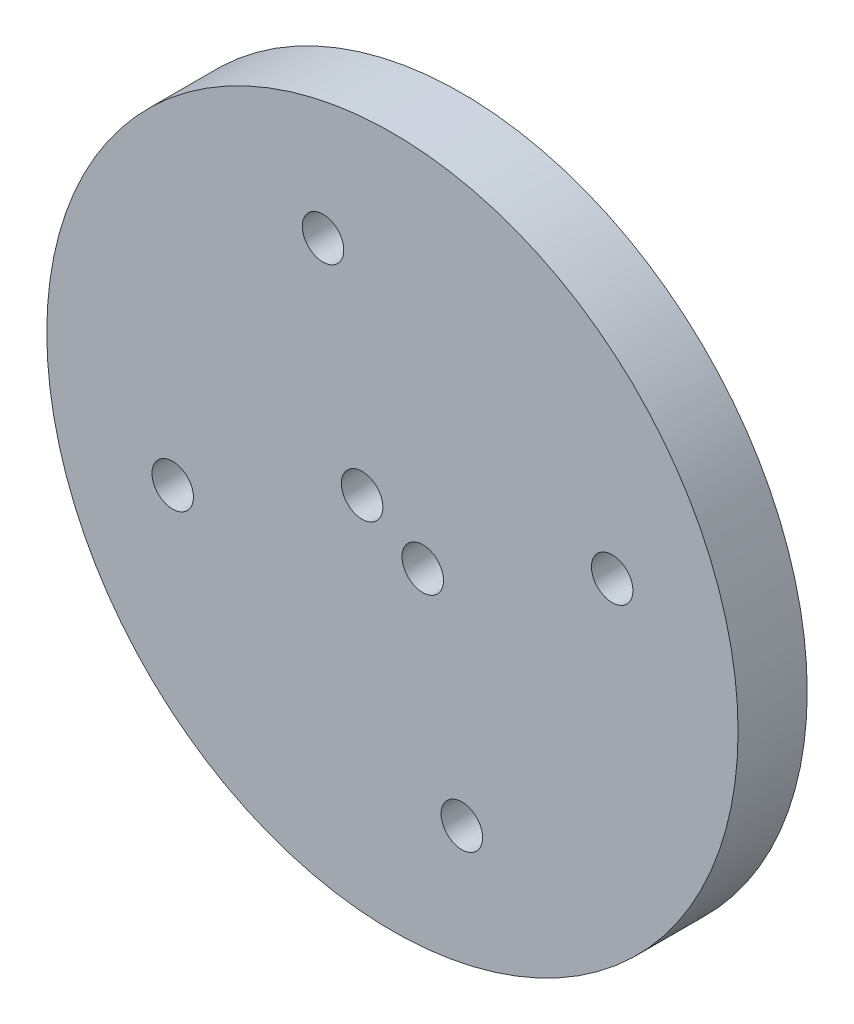
ISO-10303-21;
HEADER;
FILE_DESCRIPTION(('STEP AP214'),'2;1');
FILE_NAME('part.step','',(''),(''),'','','');
FILE_SCHEMA(('AUTOMOTIVE_DESIGN { 1 0 10303 214 1 1 1 1 }'));
ENDSEC;
DATA;
#1=APPLICATION_CONTEXT('core data for automotive mechanical design processes');
#2=APPLICATION_PROTOCOL_DEFINITION('international standard','automotive_design',2000,#1);
#3=PRODUCT_CONTEXT('',#1,'mechanical');
#4=PRODUCT('Part','Part','',(#3));
#5=PRODUCT_RELATED_PRODUCT_CATEGORY('part','',(#4));
#6=PRODUCT_DEFINITION_FORMATION('','',#4);
#7=PRODUCT_DEFINITION_CONTEXT('part definition',#1,'design');
#8=PRODUCT_DEFINITION('design','',#6,#7);
#9=PRODUCT_DEFINITION_SHAPE('','',#8);
#10=(LENGTH_UNIT() NAMED_UNIT(*) SI_UNIT(.MILLI.,.METRE.));
#11=(NAMED_UNIT(*) PLANE_ANGLE_UNIT() SI_UNIT($,.RADIAN.));
#12=(NAMED_UNIT(*) SI_UNIT($,.STERADIAN.) SOLID_ANGLE_UNIT());
#13=UNCERTAINTY_MEASURE_WITH_UNIT(LENGTH_MEASURE(1.E-05),#10,'distance_accuracy_value','');
#14=(GEOMETRIC_REPRESENTATION_CONTEXT(3) GLOBAL_UNCERTAINTY_ASSIGNED_CONTEXT((#13)) GLOBAL_UNIT_ASSIGNED_CONTEXT((#10,
#11,#12)) REPRESENTATION_CONTEXT('',''));
#15=CARTESIAN_POINT('',(0.,0.,0.));
#16=DIRECTION('',(0.,0.,1.));
#17=DIRECTION('',(1.,0.,0.));
#18=AXIS2_PLACEMENT_3D('',#15,#16,#17);
#19=CARTESIAN_POINT('',(0.,0.,3.));
#20=DIRECTION('',(0.,0.,-1.));
#21=DIRECTION('',(-1.,0.,0.));
#22=AXIS2_PLACEMENT_3D('',#19,#20,#21);
#23=CYLINDRICAL_SURFACE('',#22,15.);
#24=CARTESIAN_POINT('',(0.,0.,3.));
#25=DIRECTION('',(0.,0.,1.));
#26=DIRECTION('',(1.,0.,0.));
#27=AXIS2_PLACEMENT_3D('',#24,#25,#26);
#28=CIRCLE('',#27,15.);
#29=CARTESIAN_POINT('',(15.,0.,3.));
#30=VERTEX_POINT('',#29);
#31=EDGE_CURVE('E10',#30,#30,#28,.T.);
#32=ORIENTED_EDGE('',*,*,#31,.F.);
#33=EDGE_LOOP('',(#32));
#34=FACE_BOUND('',#33,.T.);
#35=CARTESIAN_POINT('',(0.,0.,0.));
#36=DIRECTION('',(0.,0.,1.));
#37=DIRECTION('',(1.,0.,0.));
#38=AXIS2_PLACEMENT_3D('',#35,#36,#37);
#39=CIRCLE('',#38,15.);
#40=CARTESIAN_POINT('',(15.,0.,0.));
#41=VERTEX_POINT('',#40);
#42=EDGE_CURVE('E36',#41,#41,#39,.T.);
#43=ORIENTED_EDGE('',*,*,#42,.T.);
#44=EDGE_LOOP('',(#43));
#45=FACE_BOUND('',#44,.T.);
#46=ADVANCED_FACE('F33',(#34,#45),#23,.T.);
#47=CARTESIAN_POINT('',(0.,0.,3.));
#48=DIRECTION('',(0.,0.,1.));
#49=DIRECTION('',(1.,0.,0.));
#50=AXIS2_PLACEMENT_3D('',#47,#48,#49);
#51=PLANE('',#50);
#52=CARTESIAN_POINT('',(3.0112228113094,-9.53585534604263,3.));
#53=DIRECTION('',(0.,0.,-1.));
#54=DIRECTION('',(-1.,0.,0.));
#55=AXIS2_PLACEMENT_3D('',#52,#53,#54);
#56=CIRCLE('',#55,0.9);
#57=CARTESIAN_POINT('',(2.1112228113094,-9.53585534604263,3.));
#58=VERTEX_POINT('',#57);
#59=EDGE_CURVE('E51',#58,#58,#56,.T.);
#60=ORIENTED_EDGE('',*,*,#59,.T.);
#61=EDGE_LOOP('',(#60));
#62=FACE_BOUND('',#61,.T.);
#63=CARTESIAN_POINT('',(1.3159978802333,-0.719826075674858,3.));
#64=DIRECTION('',(0.,0.,-1.));
#65=DIRECTION('',(-1.,0.,0.));
#66=AXIS2_PLACEMENT_3D('',#63,#64,#65);
#67=CIRCLE('',#66,0.9);
#68=CARTESIAN_POINT('',(0.415997880233298,-0.719826075674858,3.));
#69=VERTEX_POINT('',#68);
#70=EDGE_CURVE('E57',#69,#69,#67,.T.);
#71=ORIENTED_EDGE('',*,*,#70,.T.);
#72=EDGE_LOOP('',(#71));
#73=FACE_BOUND('',#72,.T.);
#74=CARTESIAN_POINT('',(-9.53585534604263,-3.0112228113094,3.));
#75=DIRECTION('',(0.,0.,-1.));
#76=DIRECTION('',(-1.,0.,0.));
#77=AXIS2_PLACEMENT_3D('',#74,#75,#76);
#78=CIRCLE('',#77,0.9);
#79=CARTESIAN_POINT('',(-10.4358553460426,-3.0112228113094,3.));
#80=VERTEX_POINT('',#79);
#81=EDGE_CURVE('E63',#80,#80,#78,.T.);
#82=ORIENTED_EDGE('',*,*,#81,.T.);
#83=EDGE_LOOP('',(#82));
#84=FACE_BOUND('',#83,.T.);
#85=CARTESIAN_POINT('',(9.53585534604263,3.0112228113094,3.));
#86=DIRECTION('',(0.,0.,-1.));
#87=DIRECTION('',(-1.,0.,0.));
#88=AXIS2_PLACEMENT_3D('',#85,#86,#87);
#89=CIRCLE('',#88,0.9);
#90=CARTESIAN_POINT('',(8.63585534604264,3.0112228113094,3.));
#91=VERTEX_POINT('',#90);
#92=EDGE_CURVE('E69',#91,#91,#89,.T.);
#93=ORIENTED_EDGE('',*,*,#92,.T.);
#94=EDGE_LOOP('',(#93));
#95=FACE_BOUND('',#94,.T.);
#96=CARTESIAN_POINT('',(-3.0112228113094,9.53585534604263,3.));
#97=DIRECTION('',(0.,0.,-1.));
#98=DIRECTION('',(-1.,0.,0.));
#99=AXIS2_PLACEMENT_3D('',#96,#97,#98);
#100=CIRCLE('',#99,0.9);
#101=CARTESIAN_POINT('',(-3.9112228113094,9.53585534604263,3.));
#102=VERTEX_POINT('',#101);
#103=EDGE_CURVE('E75',#102,#102,#100,.T.);
#104=ORIENTED_EDGE('',*,*,#103,.T.);
#105=EDGE_LOOP('',(#104));
#106=FACE_BOUND('',#105,.T.);
#107=CARTESIAN_POINT('',(-1.3159978802333,0.719826075674858,3.));
#108=DIRECTION('',(0.,0.,-1.));
#109=DIRECTION('',(-1.,0.,0.));
#110=AXIS2_PLACEMENT_3D('',#107,#108,#109);
#111=CIRCLE('',#110,0.9);
#112=CARTESIAN_POINT('',(-2.2159978802333,0.719826075674858,3.));
#113=VERTEX_POINT('',#112);
#114=EDGE_CURVE('E43',#113,#113,#111,.T.);
#115=ORIENTED_EDGE('',*,*,#114,.T.);
#116=EDGE_LOOP('',(#115));
#117=FACE_BOUND('',#116,.T.);
#118=ORIENTED_EDGE('',*,*,#31,.T.);
#119=EDGE_LOOP('',(#118));
#120=FACE_BOUND('',#119,.T.);
#121=ADVANCED_FACE('F87',(#62,#73,#84,#95,#106,#117,#120),#51,.T.);
#122=CARTESIAN_POINT('',(0.,0.,0.));
#123=DIRECTION('',(0.,0.,1.));
#124=DIRECTION('',(1.,0.,0.));
#125=AXIS2_PLACEMENT_3D('',#122,#123,#124);
#126=PLANE('',#125);
#127=CARTESIAN_POINT('',(3.0112228113094,-9.53585534604263,0.));
#128=DIRECTION('',(0.,0.,-1.));
#129=DIRECTION('',(-1.,0.,0.));
#130=AXIS2_PLACEMENT_3D('',#127,#128,#129);
#131=CIRCLE('',#130,0.9);
#132=CARTESIAN_POINT('',(2.1112228113094,-9.53585534604263,0.));
#133=VERTEX_POINT('',#132);
#134=EDGE_CURVE('E54',#133,#133,#131,.T.);
#135=ORIENTED_EDGE('',*,*,#134,.F.);
#136=EDGE_LOOP('',(#135));
#137=FACE_BOUND('',#136,.T.);
#138=CARTESIAN_POINT('',(1.3159978802333,-0.719826075674858,0.));
#139=DIRECTION('',(0.,0.,-1.));
#140=DIRECTION('',(-1.,0.,0.));
#141=AXIS2_PLACEMENT_3D('',#138,#139,#140);
#142=CIRCLE('',#141,0.9);
#143=CARTESIAN_POINT('',(0.415997880233298,-0.719826075674858,0.));
#144=VERTEX_POINT('',#143);
#145=EDGE_CURVE('E60',#144,#144,#142,.T.);
#146=ORIENTED_EDGE('',*,*,#145,.F.);
#147=EDGE_LOOP('',(#146));
#148=FACE_BOUND('',#147,.T.);
#149=CARTESIAN_POINT('',(-9.53585534604263,-3.0112228113094,0.));
#150=DIRECTION('',(0.,0.,-1.));
#151=DIRECTION('',(-1.,0.,0.));
#152=AXIS2_PLACEMENT_3D('',#149,#150,#151);
#153=CIRCLE('',#152,0.9);
#154=CARTESIAN_POINT('',(-10.4358553460426,-3.0112228113094,0.));
#155=VERTEX_POINT('',#154);
#156=EDGE_CURVE('E66',#155,#155,#153,.T.);
#157=ORIENTED_EDGE('',*,*,#156,.F.);
#158=EDGE_LOOP('',(#157));
#159=FACE_BOUND('',#158,.T.);
#160=CARTESIAN_POINT('',(9.53585534604263,3.0112228113094,0.));
#161=DIRECTION('',(0.,0.,-1.));
#162=DIRECTION('',(-1.,0.,0.));
#163=AXIS2_PLACEMENT_3D('',#160,#161,#162);
#164=CIRCLE('',#163,0.9);
#165=CARTESIAN_POINT('',(8.63585534604264,3.0112228113094,0.));
#166=VERTEX_POINT('',#165);
#167=EDGE_CURVE('E72',#166,#166,#164,.T.);
#168=ORIENTED_EDGE('',*,*,#167,.F.);
#169=EDGE_LOOP('',(#168));
#170=FACE_BOUND('',#169,.T.);
#171=CARTESIAN_POINT('',(-3.0112228113094,9.53585534604263,0.));
#172=DIRECTION('',(0.,0.,-1.));
#173=DIRECTION('',(-1.,0.,0.));
#174=AXIS2_PLACEMENT_3D('',#171,#172,#173);
#175=CIRCLE('',#174,0.9);
#176=CARTESIAN_POINT('',(-3.9112228113094,9.53585534604263,0.));
#177=VERTEX_POINT('',#176);
#178=EDGE_CURVE('E48',#177,#177,#175,.T.);
#179=ORIENTED_EDGE('',*,*,#178,.F.);
#180=EDGE_LOOP('',(#179));
#181=FACE_BOUND('',#180,.T.);
#182=CARTESIAN_POINT('',(-1.3159978802333,0.719826075674858,0.));
#183=DIRECTION('',(0.,0.,-1.));
#184=DIRECTION('',(-1.,0.,0.));
#185=AXIS2_PLACEMENT_3D('',#182,#183,#184);
#186=CIRCLE('',#185,0.9);
#187=CARTESIAN_POINT('',(-2.2159978802333,0.719826075674858,0.));
#188=VERTEX_POINT('',#187);
#189=EDGE_CURVE('E45',#188,#188,#186,.T.);
#190=ORIENTED_EDGE('',*,*,#189,.F.);
#191=EDGE_LOOP('',(#190));
#192=FACE_BOUND('',#191,.T.);
#193=ORIENTED_EDGE('',*,*,#42,.F.);
#194=EDGE_LOOP('',(#193));
#195=FACE_BOUND('',#194,.T.);
#196=ADVANCED_FACE('F83',(#137,#148,#159,#170,#181,#192,#195),#126,.F.);
#197=CARTESIAN_POINT('',(-1.3159978802333,0.719826075674858,3.));
#198=DIRECTION('',(0.,0.,-1.));
#199=DIRECTION('',(-1.,0.,0.));
#200=AXIS2_PLACEMENT_3D('',#197,#198,#199);
#201=CYLINDRICAL_SURFACE('',#200,0.9);
#202=ORIENTED_EDGE('',*,*,#114,.F.);
#203=EDGE_LOOP('',(#202));
#204=FACE_BOUND('',#203,.T.);
#205=ORIENTED_EDGE('',*,*,#189,.T.);
#206=EDGE_LOOP('',(#205));
#207=FACE_BOUND('',#206,.T.);
#208=ADVANCED_FACE('F86',(#204,#207),#201,.F.);
#209=CARTESIAN_POINT('',(-3.0112228113094,9.53585534604263,3.));
#210=DIRECTION('',(0.,0.,-1.));
#211=DIRECTION('',(-1.,0.,0.));
#212=AXIS2_PLACEMENT_3D('',#209,#210,#211);
#213=CYLINDRICAL_SURFACE('',#212,0.9);
#214=ORIENTED_EDGE('',*,*,#103,.F.);
#215=EDGE_LOOP('',(#214));
#216=FACE_BOUND('',#215,.T.);
#217=ORIENTED_EDGE('',*,*,#178,.T.);
#218=EDGE_LOOP('',(#217));
#219=FACE_BOUND('',#218,.T.);
#220=ADVANCED_FACE('F81',(#216,#219),#213,.F.);
#221=CARTESIAN_POINT('',(9.53585534604263,3.0112228113094,3.));
#222=DIRECTION('',(0.,0.,-1.));
#223=DIRECTION('',(-1.,0.,0.));
#224=AXIS2_PLACEMENT_3D('',#221,#222,#223);
#225=CYLINDRICAL_SURFACE('',#224,0.9);
#226=ORIENTED_EDGE('',*,*,#92,.F.);
#227=EDGE_LOOP('',(#226));
#228=FACE_BOUND('',#227,.T.);
#229=ORIENTED_EDGE('',*,*,#167,.T.);
#230=EDGE_LOOP('',(#229));
#231=FACE_BOUND('',#230,.T.);
#232=ADVANCED_FACE('F118',(#228,#231),#225,.F.);
#233=CARTESIAN_POINT('',(-9.53585534604263,-3.0112228113094,3.));
#234=DIRECTION('',(0.,0.,-1.));
#235=DIRECTION('',(-1.,0.,0.));
#236=AXIS2_PLACEMENT_3D('',#233,#234,#235);
#237=CYLINDRICAL_SURFACE('',#236,0.9);
#238=ORIENTED_EDGE('',*,*,#81,.F.);
#239=EDGE_LOOP('',(#238));
#240=FACE_BOUND('',#239,.T.);
#241=ORIENTED_EDGE('',*,*,#156,.T.);
#242=EDGE_LOOP('',(#241));
#243=FACE_BOUND('',#242,.T.);
#244=ADVANCED_FACE('F114',(#240,#243),#237,.F.);
#245=CARTESIAN_POINT('',(1.3159978802333,-0.719826075674858,3.));
#246=DIRECTION('',(0.,0.,-1.));
#247=DIRECTION('',(-1.,0.,0.));
#248=AXIS2_PLACEMENT_3D('',#245,#246,#247);
#249=CYLINDRICAL_SURFACE('',#248,0.9);
#250=ORIENTED_EDGE('',*,*,#70,.F.);
#251=EDGE_LOOP('',(#250));
#252=FACE_BOUND('',#251,.T.);
#253=ORIENTED_EDGE('',*,*,#145,.T.);
#254=EDGE_LOOP('',(#253));
#255=FACE_BOUND('',#254,.T.);
#256=ADVANCED_FACE('F110',(#252,#255),#249,.F.);
#257=CARTESIAN_POINT('',(3.0112228113094,-9.53585534604263,3.));
#258=DIRECTION('',(0.,0.,-1.));
#259=DIRECTION('',(-1.,0.,0.));
#260=AXIS2_PLACEMENT_3D('',#257,#258,#259);
#261=CYLINDRICAL_SURFACE('',#260,0.9);
#262=ORIENTED_EDGE('',*,*,#59,.F.);
#263=EDGE_LOOP('',(#262));
#264=FACE_BOUND('',#263,.T.);
#265=ORIENTED_EDGE('',*,*,#134,.T.);
#266=EDGE_LOOP('',(#265));
#267=FACE_BOUND('',#266,.T.);
#268=ADVANCED_FACE('F107',(#264,#267),#261,.F.);
#269=CLOSED_SHELL('',(#46,#121,#196,#208,#220,#232,#244,#256,#268));
#270=MANIFOLD_SOLID_BREP('B2',#269);
#271=ADVANCED_BREP_SHAPE_REPRESENTATION('',(#18,#270),#14);
#272=SHAPE_DEFINITION_REPRESENTATION(#9,#271);
ENDSEC;
END-ISO-10303-21;
